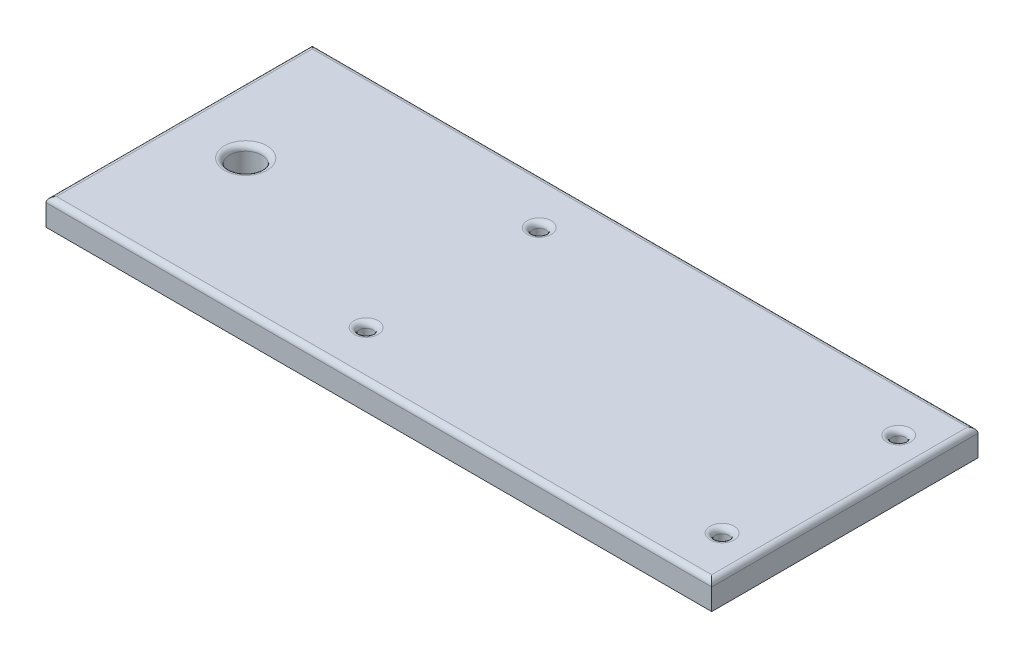
ISO-10303-21;
HEADER;
FILE_DESCRIPTION(('STEP AP214'),'2;1');
FILE_NAME('part.step','',(''),(''),'','','');
FILE_SCHEMA(('AUTOMOTIVE_DESIGN { 1 0 10303 214 1 1 1 1 }'));
ENDSEC;
DATA;
#1=APPLICATION_CONTEXT('core data for automotive mechanical design processes');
#2=APPLICATION_PROTOCOL_DEFINITION('international standard','automotive_design',2000,#1);
#3=PRODUCT_CONTEXT('',#1,'mechanical');
#4=PRODUCT('Part','Part','',(#3));
#5=PRODUCT_RELATED_PRODUCT_CATEGORY('part','',(#4));
#6=PRODUCT_DEFINITION_FORMATION('','',#4);
#7=PRODUCT_DEFINITION_CONTEXT('part definition',#1,'design');
#8=PRODUCT_DEFINITION('design','',#6,#7);
#9=PRODUCT_DEFINITION_SHAPE('','',#8);
#10=(LENGTH_UNIT() NAMED_UNIT(*) SI_UNIT(.MILLI.,.METRE.));
#11=(NAMED_UNIT(*) PLANE_ANGLE_UNIT() SI_UNIT($,.RADIAN.));
#12=(NAMED_UNIT(*) SI_UNIT($,.STERADIAN.) SOLID_ANGLE_UNIT());
#13=UNCERTAINTY_MEASURE_WITH_UNIT(LENGTH_MEASURE(1.E-05),#10,'distance_accuracy_value','');
#14=(GEOMETRIC_REPRESENTATION_CONTEXT(3) GLOBAL_UNCERTAINTY_ASSIGNED_CONTEXT((#13)) GLOBAL_UNIT_ASSIGNED_CONTEXT((#10,
#11,#12)) REPRESENTATION_CONTEXT('',''));
#15=CARTESIAN_POINT('',(0.,0.,0.));
#16=DIRECTION('',(0.,0.,1.));
#17=DIRECTION('',(1.,0.,0.));
#18=AXIS2_PLACEMENT_3D('',#15,#16,#17);
#19=CARTESIAN_POINT('',(0.,254.,0.));
#20=DIRECTION('',(0.,1.,0.));
#21=DIRECTION('',(0.,0.,1.));
#22=AXIS2_PLACEMENT_3D('',#19,#20,#21);
#23=PLANE('',#22);
#24=CARTESIAN_POINT('',(-565.912,254.,825.5));
#25=DIRECTION('',(0.,1.,0.));
#26=DIRECTION('',(0.,0.,1.));
#27=AXIS2_PLACEMENT_3D('',#24,#25,#26);
#28=CIRCLE('',#27,114.3);
#29=CARTESIAN_POINT('',(-565.912,254.,939.8));
#30=VERTEX_POINT('',#29);
#31=EDGE_CURVE('E164',#30,#30,#28,.F.);
#32=ORIENTED_EDGE('',*,*,#31,.T.);
#33=EDGE_LOOP('',(#32));
#34=FACE_BOUND('',#33,.T.);
#35=CARTESIAN_POINT('',(2863.088,254.,-825.5));
#36=DIRECTION('',(0.,1.,0.));
#37=DIRECTION('',(0.,0.,1.));
#38=AXIS2_PLACEMENT_3D('',#35,#36,#37);
#39=CIRCLE('',#38,114.3);
#40=CARTESIAN_POINT('',(2863.088,254.,-711.2));
#41=VERTEX_POINT('',#40);
#42=EDGE_CURVE('E165',#41,#41,#39,.F.);
#43=ORIENTED_EDGE('',*,*,#42,.T.);
#44=EDGE_LOOP('',(#43));
#45=FACE_BOUND('',#44,.T.);
#46=CARTESIAN_POINT('',(2829.70046082949,254.,825.5));
#47=DIRECTION('',(0.,1.,0.));
#48=DIRECTION('',(0.,0.,1.));
#49=AXIS2_PLACEMENT_3D('',#46,#47,#48);
#50=CIRCLE('',#49,114.3);
#51=CARTESIAN_POINT('',(2829.70046082949,254.,939.8));
#52=VERTEX_POINT('',#51);
#53=EDGE_CURVE('E157',#52,#52,#50,.F.);
#54=ORIENTED_EDGE('',*,*,#53,.T.);
#55=EDGE_LOOP('',(#54));
#56=FACE_BOUND('',#55,.T.);
#57=CARTESIAN_POINT('',(-565.912,254.,-825.5));
#58=DIRECTION('',(0.,1.,0.));
#59=DIRECTION('',(0.,0.,1.));
#60=AXIS2_PLACEMENT_3D('',#57,#58,#59);
#61=CIRCLE('',#60,114.3);
#62=CARTESIAN_POINT('',(-565.912,254.,-711.2));
#63=VERTEX_POINT('',#62);
#64=EDGE_CURVE('E156',#63,#63,#61,.F.);
#65=ORIENTED_EDGE('',*,*,#64,.T.);
#66=EDGE_LOOP('',(#65));
#67=FACE_BOUND('',#66,.T.);
#68=CARTESIAN_POINT('',(-2540.,254.,0.));
#69=DIRECTION('',(0.,1.,0.));
#70=DIRECTION('',(0.,0.,1.));
#71=AXIS2_PLACEMENT_3D('',#68,#69,#70);
#72=CIRCLE('',#71,203.2);
#73=CARTESIAN_POINT('',(-2540.,254.,203.2));
#74=VERTEX_POINT('',#73);
#75=EDGE_CURVE('E153',#74,#74,#72,.F.);
#76=ORIENTED_EDGE('',*,*,#75,.T.);
#77=EDGE_LOOP('',(#76));
#78=FACE_BOUND('',#77,.T.);
#79=DIRECTION('',(0.,0.,-1.));
#80=VECTOR('',#79,1.);
#81=CARTESIAN_POINT('',(3124.2,254.,-1270.));
#82=LINE('',#81,#80);
#83=CARTESIAN_POINT('',(3124.2,254.,1219.2));
#84=VERTEX_POINT('',#83);
#85=CARTESIAN_POINT('',(3124.2,254.,-1219.2));
#86=VERTEX_POINT('',#85);
#87=EDGE_CURVE('E146',#84,#86,#82,.T.);
#88=ORIENTED_EDGE('',*,*,#87,.T.);
#89=DIRECTION('',(-1.,0.,0.));
#90=VECTOR('',#89,1.);
#91=CARTESIAN_POINT('',(-3175.,254.,-1219.2));
#92=LINE('',#91,#90);
#93=CARTESIAN_POINT('',(-3124.2,254.,-1219.2));
#94=VERTEX_POINT('',#93);
#95=EDGE_CURVE('E151',#86,#94,#92,.T.);
#96=ORIENTED_EDGE('',*,*,#95,.T.);
#97=DIRECTION('',(0.,0.,1.));
#98=VECTOR('',#97,1.);
#99=CARTESIAN_POINT('',(-3124.2,254.,1270.));
#100=LINE('',#99,#98);
#101=CARTESIAN_POINT('',(-3124.2,254.,1219.2));
#102=VERTEX_POINT('',#101);
#103=EDGE_CURVE('E148',#94,#102,#100,.T.);
#104=ORIENTED_EDGE('',*,*,#103,.T.);
#105=DIRECTION('',(1.,0.,0.));
#106=VECTOR('',#105,1.);
#107=CARTESIAN_POINT('',(3175.,254.,1219.2));
#108=LINE('',#107,#106);
#109=EDGE_CURVE('E145',#102,#84,#108,.T.);
#110=ORIENTED_EDGE('',*,*,#109,.T.);
#111=EDGE_LOOP('',(#88,#96,#104,#110));
#112=FACE_BOUND('',#111,.T.);
#113=ADVANCED_FACE('F43',(#34,#45,#56,#67,#78,#112),#23,.T.);
#114=CARTESIAN_POINT('',(0.,0.,0.));
#115=DIRECTION('',(0.,1.,0.));
#116=DIRECTION('',(0.,0.,1.));
#117=AXIS2_PLACEMENT_3D('',#114,#115,#116);
#118=PLANE('',#117);
#119=CARTESIAN_POINT('',(-565.912,0.,825.5));
#120=DIRECTION('',(0.,1.,0.));
#121=DIRECTION('',(0.,0.,1.));
#122=AXIS2_PLACEMENT_3D('',#119,#120,#121);
#123=CIRCLE('',#122,114.3);
#124=CARTESIAN_POINT('',(-565.912,0.,939.8));
#125=VERTEX_POINT('',#124);
#126=EDGE_CURVE('E110',#125,#125,#123,.T.);
#127=ORIENTED_EDGE('',*,*,#126,.T.);
#128=EDGE_LOOP('',(#127));
#129=FACE_BOUND('',#128,.T.);
#130=DIRECTION('',(0.,0.,-1.));
#131=VECTOR('',#130,1.);
#132=CARTESIAN_POINT('',(3175.,0.,-1270.));
#133=LINE('',#132,#131);
#134=CARTESIAN_POINT('',(3175.,0.,1270.));
#135=VERTEX_POINT('',#134);
#136=CARTESIAN_POINT('',(3175.,0.,-1270.));
#137=VERTEX_POINT('',#136);
#138=EDGE_CURVE('E113',#135,#137,#133,.T.);
#139=ORIENTED_EDGE('',*,*,#138,.F.);
#140=DIRECTION('',(1.,0.,0.));
#141=VECTOR('',#140,1.);
#142=CARTESIAN_POINT('',(-3175.,0.,1270.));
#143=LINE('',#142,#141);
#144=CARTESIAN_POINT('',(-3175.,0.,1270.));
#145=VERTEX_POINT('',#144);
#146=EDGE_CURVE('E128',#145,#135,#143,.T.);
#147=ORIENTED_EDGE('',*,*,#146,.F.);
#148=DIRECTION('',(0.,0.,1.));
#149=VECTOR('',#148,1.);
#150=CARTESIAN_POINT('',(-3175.,0.,-1270.));
#151=LINE('',#150,#149);
#152=CARTESIAN_POINT('',(-3175.,0.,-1270.));
#153=VERTEX_POINT('',#152);
#154=EDGE_CURVE('E116',#153,#145,#151,.T.);
#155=ORIENTED_EDGE('',*,*,#154,.F.);
#156=DIRECTION('',(-1.,0.,0.));
#157=VECTOR('',#156,1.);
#158=CARTESIAN_POINT('',(-3175.,0.,-1270.));
#159=LINE('',#158,#157);
#160=EDGE_CURVE('E99',#137,#153,#159,.T.);
#161=ORIENTED_EDGE('',*,*,#160,.F.);
#162=EDGE_LOOP('',(#139,#147,#155,#161));
#163=FACE_BOUND('',#162,.T.);
#164=CARTESIAN_POINT('',(-2540.,0.,0.));
#165=DIRECTION('',(0.,1.,0.));
#166=DIRECTION('',(0.,0.,1.));
#167=AXIS2_PLACEMENT_3D('',#164,#165,#166);
#168=CIRCLE('',#167,152.4);
#169=CARTESIAN_POINT('',(-2540.,0.,152.4));
#170=VERTEX_POINT('',#169);
#171=EDGE_CURVE('E124',#170,#170,#168,.T.);
#172=ORIENTED_EDGE('',*,*,#171,.T.);
#173=EDGE_LOOP('',(#172));
#174=FACE_BOUND('',#173,.T.);
#175=CARTESIAN_POINT('',(-565.912,0.,-825.5));
#176=DIRECTION('',(0.,1.,0.));
#177=DIRECTION('',(0.,0.,1.));
#178=AXIS2_PLACEMENT_3D('',#175,#176,#177);
#179=CIRCLE('',#178,63.5);
#180=CARTESIAN_POINT('',(-565.912,0.,-762.));
#181=VERTEX_POINT('',#180);
#182=EDGE_CURVE('E123',#181,#181,#179,.T.);
#183=ORIENTED_EDGE('',*,*,#182,.T.);
#184=EDGE_LOOP('',(#183));
#185=FACE_BOUND('',#184,.T.);
#186=CARTESIAN_POINT('',(2829.70046082949,0.,825.5));
#187=DIRECTION('',(0.,1.,0.));
#188=DIRECTION('',(0.,0.,1.));
#189=AXIS2_PLACEMENT_3D('',#186,#187,#188);
#190=CIRCLE('',#189,63.4999999999998);
#191=CARTESIAN_POINT('',(2829.70046082949,0.,889.));
#192=VERTEX_POINT('',#191);
#193=EDGE_CURVE('E196',#192,#192,#190,.T.);
#194=ORIENTED_EDGE('',*,*,#193,.T.);
#195=EDGE_LOOP('',(#194));
#196=FACE_BOUND('',#195,.T.);
#197=CARTESIAN_POINT('',(2863.088,0.,-825.5));
#198=DIRECTION('',(0.,1.,0.));
#199=DIRECTION('',(0.,0.,1.));
#200=AXIS2_PLACEMENT_3D('',#197,#198,#199);
#201=CIRCLE('',#200,63.4999999999998);
#202=CARTESIAN_POINT('',(2863.088,0.,-762.));
#203=VERTEX_POINT('',#202);
#204=EDGE_CURVE('E195',#203,#203,#201,.T.);
#205=ORIENTED_EDGE('',*,*,#204,.T.);
#206=EDGE_LOOP('',(#205));
#207=FACE_BOUND('',#206,.T.);
#208=ADVANCED_FACE('F115',(#129,#163,#174,#185,#196,#207),#118,.F.);
#209=CARTESIAN_POINT('',(3175.,254.,-1270.));
#210=DIRECTION('',(-1.,0.,0.));
#211=DIRECTION('',(0.,0.,1.));
#212=AXIS2_PLACEMENT_3D('',#209,#210,#211);
#213=PLANE('',#212);
#214=DIRECTION('',(0.,-1.,0.));
#215=VECTOR('',#214,1.);
#216=CARTESIAN_POINT('',(3175.,254.,-1270.));
#217=LINE('',#216,#215);
#218=CARTESIAN_POINT('',(3175.,203.2,-1270.));
#219=VERTEX_POINT('',#218);
#220=EDGE_CURVE('E100',#219,#137,#217,.T.);
#221=ORIENTED_EDGE('',*,*,#220,.F.);
#222=DIRECTION('',(0.,0.,-1.));
#223=VECTOR('',#222,1.);
#224=CARTESIAN_POINT('',(3175.,203.2,1270.));
#225=LINE('',#224,#223);
#226=CARTESIAN_POINT('',(3175.,203.2,1270.));
#227=VERTEX_POINT('',#226);
#228=EDGE_CURVE('E179',#219,#227,#225,.F.);
#229=ORIENTED_EDGE('',*,*,#228,.T.);
#230=DIRECTION('',(0.,-1.,0.));
#231=VECTOR('',#230,1.);
#232=CARTESIAN_POINT('',(3175.,254.,1270.));
#233=LINE('',#232,#231);
#234=EDGE_CURVE('E117',#227,#135,#233,.T.);
#235=ORIENTED_EDGE('',*,*,#234,.T.);
#236=ORIENTED_EDGE('',*,*,#138,.T.);
#237=EDGE_LOOP('',(#221,#229,#235,#236));
#238=FACE_BOUND('',#237,.T.);
#239=ADVANCED_FACE('F118',(#238),#213,.F.);
#240=CARTESIAN_POINT('',(-3175.,254.,-1270.));
#241=DIRECTION('',(0.,0.,1.));
#242=DIRECTION('',(1.,0.,0.));
#243=AXIS2_PLACEMENT_3D('',#240,#241,#242);
#244=PLANE('',#243);
#245=DIRECTION('',(0.,-1.,0.));
#246=VECTOR('',#245,1.);
#247=CARTESIAN_POINT('',(-3175.,254.,-1270.));
#248=LINE('',#247,#246);
#249=CARTESIAN_POINT('',(-3175.,203.2,-1270.));
#250=VERTEX_POINT('',#249);
#251=EDGE_CURVE('E107',#250,#153,#248,.T.);
#252=ORIENTED_EDGE('',*,*,#251,.F.);
#253=DIRECTION('',(-1.,0.,0.));
#254=VECTOR('',#253,1.);
#255=CARTESIAN_POINT('',(3175.,203.2,-1270.));
#256=LINE('',#255,#254);
#257=EDGE_CURVE('E55',#250,#219,#256,.F.);
#258=ORIENTED_EDGE('',*,*,#257,.T.);
#259=ORIENTED_EDGE('',*,*,#220,.T.);
#260=ORIENTED_EDGE('',*,*,#160,.T.);
#261=EDGE_LOOP('',(#252,#258,#259,#260));
#262=FACE_BOUND('',#261,.T.);
#263=ADVANCED_FACE('F97',(#262),#244,.F.);
#264=CARTESIAN_POINT('',(-3175.,254.,-1270.));
#265=DIRECTION('',(1.,0.,0.));
#266=DIRECTION('',(0.,0.,-1.));
#267=AXIS2_PLACEMENT_3D('',#264,#265,#266);
#268=PLANE('',#267);
#269=DIRECTION('',(0.,-1.,0.));
#270=VECTOR('',#269,1.);
#271=CARTESIAN_POINT('',(-3175.,254.,1270.));
#272=LINE('',#271,#270);
#273=CARTESIAN_POINT('',(-3175.,203.2,1270.));
#274=VERTEX_POINT('',#273);
#275=EDGE_CURVE('E135',#274,#145,#272,.T.);
#276=ORIENTED_EDGE('',*,*,#275,.F.);
#277=DIRECTION('',(0.,0.,1.));
#278=VECTOR('',#277,1.);
#279=CARTESIAN_POINT('',(-3175.,203.2,-1270.));
#280=LINE('',#279,#278);
#281=EDGE_CURVE('E58',#274,#250,#280,.F.);
#282=ORIENTED_EDGE('',*,*,#281,.T.);
#283=ORIENTED_EDGE('',*,*,#251,.T.);
#284=ORIENTED_EDGE('',*,*,#154,.T.);
#285=EDGE_LOOP('',(#276,#282,#283,#284));
#286=FACE_BOUND('',#285,.T.);
#287=ADVANCED_FACE('F240',(#286),#268,.F.);
#288=CARTESIAN_POINT('',(-3175.,254.,1270.));
#289=DIRECTION('',(0.,0.,-1.));
#290=DIRECTION('',(-1.,0.,0.));
#291=AXIS2_PLACEMENT_3D('',#288,#289,#290);
#292=PLANE('',#291);
#293=ORIENTED_EDGE('',*,*,#234,.F.);
#294=DIRECTION('',(1.,0.,0.));
#295=VECTOR('',#294,1.);
#296=CARTESIAN_POINT('',(-3175.,203.2,1270.));
#297=LINE('',#296,#295);
#298=EDGE_CURVE('E11',#227,#274,#297,.F.);
#299=ORIENTED_EDGE('',*,*,#298,.T.);
#300=ORIENTED_EDGE('',*,*,#275,.T.);
#301=ORIENTED_EDGE('',*,*,#146,.T.);
#302=EDGE_LOOP('',(#293,#299,#300,#301));
#303=FACE_BOUND('',#302,.T.);
#304=ADVANCED_FACE('F225',(#303),#292,.F.);
#305=CARTESIAN_POINT('',(-2540.,254.,0.));
#306=DIRECTION('',(0.,-1.,0.));
#307=DIRECTION('',(0.,0.,-1.));
#308=AXIS2_PLACEMENT_3D('',#305,#306,#307);
#309=CYLINDRICAL_SURFACE('',#308,152.4);
#310=CARTESIAN_POINT('',(-2540.,203.2,0.));
#311=DIRECTION('',(0.,1.,0.));
#312=DIRECTION('',(0.,0.,1.));
#313=AXIS2_PLACEMENT_3D('',#310,#311,#312);
#314=CIRCLE('',#313,152.4);
#315=CARTESIAN_POINT('',(-2540.,203.2,152.4));
#316=VERTEX_POINT('',#315);
#317=EDGE_CURVE('E176',#316,#316,#314,.T.);
#318=ORIENTED_EDGE('',*,*,#317,.T.);
#319=EDGE_LOOP('',(#318));
#320=FACE_BOUND('',#319,.T.);
#321=ORIENTED_EDGE('',*,*,#171,.F.);
#322=EDGE_LOOP('',(#321));
#323=FACE_BOUND('',#322,.T.);
#324=ADVANCED_FACE('F215',(#320,#323),#309,.F.);
#325=CARTESIAN_POINT('',(-565.912,254.,-825.5));
#326=DIRECTION('',(0.,-1.,0.));
#327=DIRECTION('',(0.,0.,-1.));
#328=AXIS2_PLACEMENT_3D('',#325,#326,#327);
#329=CYLINDRICAL_SURFACE('',#328,63.5);
#330=CARTESIAN_POINT('',(-565.912,203.2,-825.5));
#331=DIRECTION('',(0.,1.,0.));
#332=DIRECTION('',(0.,0.,1.));
#333=AXIS2_PLACEMENT_3D('',#330,#331,#332);
#334=CIRCLE('',#333,63.5);
#335=CARTESIAN_POINT('',(-565.912,203.2,-762.));
#336=VERTEX_POINT('',#335);
#337=EDGE_CURVE('E173',#336,#336,#334,.T.);
#338=ORIENTED_EDGE('',*,*,#337,.T.);
#339=EDGE_LOOP('',(#338));
#340=FACE_BOUND('',#339,.T.);
#341=ORIENTED_EDGE('',*,*,#182,.F.);
#342=EDGE_LOOP('',(#341));
#343=FACE_BOUND('',#342,.T.);
#344=ADVANCED_FACE('F207',(#340,#343),#329,.F.);
#345=CARTESIAN_POINT('',(-565.912,254.,825.5));
#346=DIRECTION('',(0.,-1.,0.));
#347=DIRECTION('',(0.,0.,-1.));
#348=AXIS2_PLACEMENT_3D('',#345,#346,#347);
#349=CYLINDRICAL_SURFACE('',#348,63.5);
#350=CARTESIAN_POINT('',(-565.912,50.8,825.5));
#351=DIRECTION('',(0.,1.,0.));
#352=DIRECTION('',(0.,0.,1.));
#353=AXIS2_PLACEMENT_3D('',#350,#351,#352);
#354=CIRCLE('',#353,63.5);
#355=CARTESIAN_POINT('',(-565.912,50.8,889.));
#356=VERTEX_POINT('',#355);
#357=EDGE_CURVE('E143',#356,#356,#354,.F.);
#358=ORIENTED_EDGE('',*,*,#357,.T.);
#359=EDGE_LOOP('',(#358));
#360=FACE_BOUND('',#359,.T.);
#361=CARTESIAN_POINT('',(-565.912,203.2,825.5));
#362=DIRECTION('',(0.,1.,0.));
#363=DIRECTION('',(0.,0.,1.));
#364=AXIS2_PLACEMENT_3D('',#361,#362,#363);
#365=CIRCLE('',#364,63.5);
#366=CARTESIAN_POINT('',(-565.912,203.2,889.));
#367=VERTEX_POINT('',#366);
#368=EDGE_CURVE('E140',#367,#367,#365,.T.);
#369=ORIENTED_EDGE('',*,*,#368,.T.);
#370=EDGE_LOOP('',(#369));
#371=FACE_BOUND('',#370,.T.);
#372=ADVANCED_FACE('F211',(#360,#371),#349,.F.);
#373=CARTESIAN_POINT('',(2829.70046082949,254.,825.5));
#374=DIRECTION('',(0.,-1.,0.));
#375=DIRECTION('',(0.,0.,-1.));
#376=AXIS2_PLACEMENT_3D('',#373,#374,#375);
#377=CYLINDRICAL_SURFACE('',#376,63.4999999999998);
#378=CARTESIAN_POINT('',(2829.70046082949,203.2,825.5));
#379=DIRECTION('',(0.,1.,0.));
#380=DIRECTION('',(0.,0.,1.));
#381=AXIS2_PLACEMENT_3D('',#378,#379,#380);
#382=CIRCLE('',#381,63.4999999999998);
#383=CARTESIAN_POINT('',(2829.70046082949,203.2,889.));
#384=VERTEX_POINT('',#383);
#385=EDGE_CURVE('E174',#384,#384,#382,.T.);
#386=ORIENTED_EDGE('',*,*,#385,.T.);
#387=EDGE_LOOP('',(#386));
#388=FACE_BOUND('',#387,.T.);
#389=ORIENTED_EDGE('',*,*,#193,.F.);
#390=EDGE_LOOP('',(#389));
#391=FACE_BOUND('',#390,.T.);
#392=ADVANCED_FACE('F218',(#388,#391),#377,.F.);
#393=CARTESIAN_POINT('',(2863.088,254.,-825.5));
#394=DIRECTION('',(0.,-1.,0.));
#395=DIRECTION('',(0.,0.,-1.));
#396=AXIS2_PLACEMENT_3D('',#393,#394,#395);
#397=CYLINDRICAL_SURFACE('',#396,63.4999999999998);
#398=CARTESIAN_POINT('',(2863.088,203.2,-825.5));
#399=DIRECTION('',(0.,1.,0.));
#400=DIRECTION('',(0.,0.,1.));
#401=AXIS2_PLACEMENT_3D('',#398,#399,#400);
#402=CIRCLE('',#401,63.4999999999998);
#403=CARTESIAN_POINT('',(2863.088,203.2,-762.));
#404=VERTEX_POINT('',#403);
#405=EDGE_CURVE('E169',#404,#404,#402,.T.);
#406=ORIENTED_EDGE('',*,*,#405,.T.);
#407=EDGE_LOOP('',(#406));
#408=FACE_BOUND('',#407,.T.);
#409=ORIENTED_EDGE('',*,*,#204,.F.);
#410=EDGE_LOOP('',(#409));
#411=FACE_BOUND('',#410,.T.);
#412=ADVANCED_FACE('F250',(#408,#411),#397,.F.);
#413=CARTESIAN_POINT('',(-565.912,50.8,825.5));
#414=DIRECTION('',(0.,1.,0.));
#415=DIRECTION('',(0.,0.,1.));
#416=AXIS2_PLACEMENT_3D('',#413,#414,#415);
#417=TOROIDAL_SURFACE('',#416,114.3,50.8);
#418=ORIENTED_EDGE('',*,*,#357,.F.);
#419=EDGE_LOOP('',(#418));
#420=FACE_BOUND('',#419,.T.);
#421=ORIENTED_EDGE('',*,*,#126,.F.);
#422=EDGE_LOOP('',(#421));
#423=FACE_BOUND('',#422,.T.);
#424=ADVANCED_FACE('F243',(#420,#423),#417,.T.);
#425=CARTESIAN_POINT('',(-565.912,203.2,825.5));
#426=DIRECTION('',(0.,1.,0.));
#427=DIRECTION('',(0.,0.,1.));
#428=AXIS2_PLACEMENT_3D('',#425,#426,#427);
#429=TOROIDAL_SURFACE('',#428,114.3,50.8);
#430=ORIENTED_EDGE('',*,*,#31,.F.);
#431=EDGE_LOOP('',(#430));
#432=FACE_BOUND('',#431,.T.);
#433=ORIENTED_EDGE('',*,*,#368,.F.);
#434=EDGE_LOOP('',(#433));
#435=FACE_BOUND('',#434,.T.);
#436=ADVANCED_FACE('F249',(#432,#435),#429,.T.);
#437=CARTESIAN_POINT('',(2863.088,203.2,-825.5));
#438=DIRECTION('',(0.,1.,0.));
#439=DIRECTION('',(0.,0.,1.));
#440=AXIS2_PLACEMENT_3D('',#437,#438,#439);
#441=TOROIDAL_SURFACE('',#440,114.3,50.8);
#442=ORIENTED_EDGE('',*,*,#42,.F.);
#443=EDGE_LOOP('',(#442));
#444=FACE_BOUND('',#443,.T.);
#445=ORIENTED_EDGE('',*,*,#405,.F.);
#446=EDGE_LOOP('',(#445));
#447=FACE_BOUND('',#446,.T.);
#448=ADVANCED_FACE('F252',(#444,#447),#441,.T.);
#449=CARTESIAN_POINT('',(2829.70046082949,203.2,825.5));
#450=DIRECTION('',(0.,1.,0.));
#451=DIRECTION('',(0.,0.,1.));
#452=AXIS2_PLACEMENT_3D('',#449,#450,#451);
#453=TOROIDAL_SURFACE('',#452,114.3,50.8);
#454=ORIENTED_EDGE('',*,*,#53,.F.);
#455=EDGE_LOOP('',(#454));
#456=FACE_BOUND('',#455,.T.);
#457=ORIENTED_EDGE('',*,*,#385,.F.);
#458=EDGE_LOOP('',(#457));
#459=FACE_BOUND('',#458,.T.);
#460=ADVANCED_FACE('F258',(#456,#459),#453,.T.);
#461=CARTESIAN_POINT('',(-565.912,203.2,-825.5));
#462=DIRECTION('',(0.,1.,0.));
#463=DIRECTION('',(0.,0.,1.));
#464=AXIS2_PLACEMENT_3D('',#461,#462,#463);
#465=TOROIDAL_SURFACE('',#464,114.3,50.8);
#466=ORIENTED_EDGE('',*,*,#64,.F.);
#467=EDGE_LOOP('',(#466));
#468=FACE_BOUND('',#467,.T.);
#469=ORIENTED_EDGE('',*,*,#337,.F.);
#470=EDGE_LOOP('',(#469));
#471=FACE_BOUND('',#470,.T.);
#472=ADVANCED_FACE('F257',(#468,#471),#465,.T.);
#473=CARTESIAN_POINT('',(-3124.2,203.2,0.));
#474=DIRECTION('',(0.,0.,-1.));
#475=DIRECTION('',(-1.,0.,0.));
#476=AXIS2_PLACEMENT_3D('',#473,#474,#475);
#477=CYLINDRICAL_SURFACE('',#476,50.8);
#478=CARTESIAN_POINT('',(-3124.2,203.2,-1219.2));
#479=DIRECTION('',(0.707106781186547,0.,-0.707106781186547));
#480=DIRECTION('',(0.707106781186547,0.,0.707106781186547));
#481=AXIS2_PLACEMENT_3D('',#478,#479,#480);
#482=ELLIPSE('',#481,71.8420489685532,50.8);
#483=EDGE_CURVE('E186',#250,#94,#482,.T.);
#484=ORIENTED_EDGE('',*,*,#483,.F.);
#485=ORIENTED_EDGE('',*,*,#281,.F.);
#486=CARTESIAN_POINT('',(-3124.2,203.2,1219.2));
#487=DIRECTION('',(-0.707106781186547,0.,-0.707106781186547));
#488=DIRECTION('',(-0.707106781186547,0.,0.707106781186547));
#489=AXIS2_PLACEMENT_3D('',#486,#487,#488);
#490=ELLIPSE('',#489,71.8420489685532,50.8);
#491=EDGE_CURVE('E50',#102,#274,#490,.F.);
#492=ORIENTED_EDGE('',*,*,#491,.F.);
#493=ORIENTED_EDGE('',*,*,#103,.F.);
#494=EDGE_LOOP('',(#484,#485,#492,#493));
#495=FACE_BOUND('',#494,.T.);
#496=ADVANCED_FACE('F262',(#495),#477,.T.);
#497=CARTESIAN_POINT('',(0.,203.2,1219.2));
#498=DIRECTION('',(-1.,0.,0.));
#499=DIRECTION('',(0.,0.,1.));
#500=AXIS2_PLACEMENT_3D('',#497,#498,#499);
#501=CYLINDRICAL_SURFACE('',#500,50.8);
#502=ORIENTED_EDGE('',*,*,#491,.T.);
#503=ORIENTED_EDGE('',*,*,#298,.F.);
#504=CARTESIAN_POINT('',(3124.2,203.2,1219.2));
#505=DIRECTION('',(-0.707106781186547,0.,0.707106781186547));
#506=DIRECTION('',(-0.707106781186547,0.,-0.707106781186547));
#507=AXIS2_PLACEMENT_3D('',#504,#505,#506);
#508=ELLIPSE('',#507,71.8420489685532,50.8);
#509=EDGE_CURVE('E189',#84,#227,#508,.F.);
#510=ORIENTED_EDGE('',*,*,#509,.F.);
#511=ORIENTED_EDGE('',*,*,#109,.F.);
#512=EDGE_LOOP('',(#502,#503,#510,#511));
#513=FACE_BOUND('',#512,.T.);
#514=ADVANCED_FACE('F272',(#513),#501,.T.);
#515=CARTESIAN_POINT('',(0.,203.2,-1219.2));
#516=DIRECTION('',(1.,0.,0.));
#517=DIRECTION('',(0.,0.,-1.));
#518=AXIS2_PLACEMENT_3D('',#515,#516,#517);
#519=CYLINDRICAL_SURFACE('',#518,50.8);
#520=ORIENTED_EDGE('',*,*,#483,.T.);
#521=ORIENTED_EDGE('',*,*,#95,.F.);
#522=CARTESIAN_POINT('',(3124.2,203.2,-1219.2));
#523=DIRECTION('',(0.707106781186547,0.,0.707106781186547));
#524=DIRECTION('',(0.707106781186547,0.,-0.707106781186547));
#525=AXIS2_PLACEMENT_3D('',#522,#523,#524);
#526=ELLIPSE('',#525,71.8420489685532,50.8);
#527=EDGE_CURVE('E184',#219,#86,#526,.T.);
#528=ORIENTED_EDGE('',*,*,#527,.F.);
#529=ORIENTED_EDGE('',*,*,#257,.F.);
#530=EDGE_LOOP('',(#520,#521,#528,#529));
#531=FACE_BOUND('',#530,.T.);
#532=ADVANCED_FACE('F267',(#531),#519,.T.);
#533=CARTESIAN_POINT('',(3124.2,203.2,0.));
#534=DIRECTION('',(0.,0.,1.));
#535=DIRECTION('',(1.,0.,0.));
#536=AXIS2_PLACEMENT_3D('',#533,#534,#535);
#537=CYLINDRICAL_SURFACE('',#536,50.8);
#538=ORIENTED_EDGE('',*,*,#509,.T.);
#539=ORIENTED_EDGE('',*,*,#228,.F.);
#540=ORIENTED_EDGE('',*,*,#527,.T.);
#541=ORIENTED_EDGE('',*,*,#87,.F.);
#542=EDGE_LOOP('',(#538,#539,#540,#541));
#543=FACE_BOUND('',#542,.T.);
#544=ADVANCED_FACE('F266',(#543),#537,.T.);
#545=CARTESIAN_POINT('',(-2540.,203.2,0.));
#546=DIRECTION('',(0.,1.,0.));
#547=DIRECTION('',(0.,0.,1.));
#548=AXIS2_PLACEMENT_3D('',#545,#546,#547);
#549=TOROIDAL_SURFACE('',#548,203.2,50.8);
#550=ORIENTED_EDGE('',*,*,#75,.F.);
#551=EDGE_LOOP('',(#550));
#552=FACE_BOUND('',#551,.T.);
#553=ORIENTED_EDGE('',*,*,#317,.F.);
#554=EDGE_LOOP('',(#553));
#555=FACE_BOUND('',#554,.T.);
#556=ADVANCED_FACE('F44',(#552,#555),#549,.T.);
#557=CLOSED_SHELL('',(#113,#208,#239,#263,#287,#304,#324,#344,#372,#392,#412,#424,#436,#448,
#460,#472,#496,#514,#532,#544,#556));
#558=MANIFOLD_SOLID_BREP('B2',#557);
#559=ADVANCED_BREP_SHAPE_REPRESENTATION('',(#18,#558),#14);
#560=SHAPE_DEFINITION_REPRESENTATION(#9,#559);
ENDSEC;
END-ISO-10303-21;
